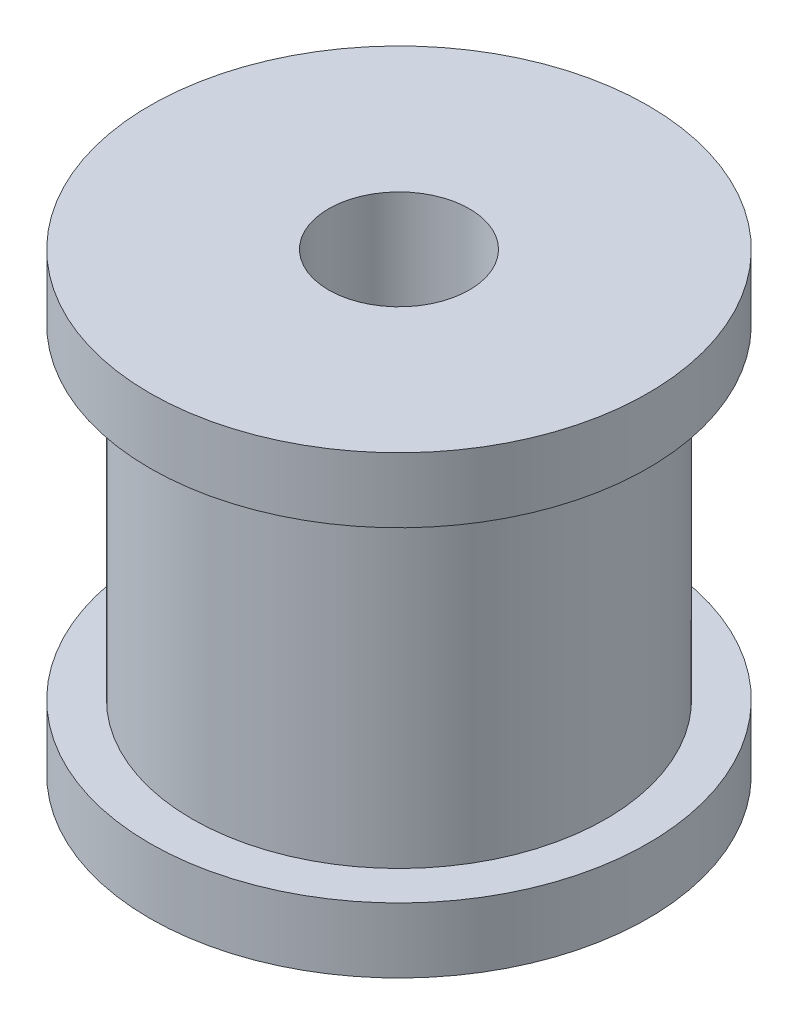
ISO-10303-21;
HEADER;
FILE_DESCRIPTION(('STEP AP214'),'2;1');
FILE_NAME('part.step','',(''),(''),'','','');
FILE_SCHEMA(('AUTOMOTIVE_DESIGN { 1 0 10303 214 1 1 1 1 }'));
ENDSEC;
DATA;
#1=APPLICATION_CONTEXT('core data for automotive mechanical design processes');
#2=APPLICATION_PROTOCOL_DEFINITION('international standard','automotive_design',2000,#1);
#3=PRODUCT_CONTEXT('',#1,'mechanical');
#4=PRODUCT('Part','Part','',(#3));
#5=PRODUCT_RELATED_PRODUCT_CATEGORY('part','',(#4));
#6=PRODUCT_DEFINITION_FORMATION('','',#4);
#7=PRODUCT_DEFINITION_CONTEXT('part definition',#1,'design');
#8=PRODUCT_DEFINITION('design','',#6,#7);
#9=PRODUCT_DEFINITION_SHAPE('','',#8);
#10=(LENGTH_UNIT() NAMED_UNIT(*) SI_UNIT(.MILLI.,.METRE.));
#11=(NAMED_UNIT(*) PLANE_ANGLE_UNIT() SI_UNIT($,.RADIAN.));
#12=(NAMED_UNIT(*) SI_UNIT($,.STERADIAN.) SOLID_ANGLE_UNIT());
#13=UNCERTAINTY_MEASURE_WITH_UNIT(LENGTH_MEASURE(1.E-05),#10,'distance_accuracy_value','');
#14=(GEOMETRIC_REPRESENTATION_CONTEXT(3) GLOBAL_UNCERTAINTY_ASSIGNED_CONTEXT((#13)) GLOBAL_UNIT_ASSIGNED_CONTEXT((#10,
#11,#12)) REPRESENTATION_CONTEXT('',''));
#15=CARTESIAN_POINT('',(0.,0.,0.));
#16=DIRECTION('',(0.,0.,1.));
#17=DIRECTION('',(1.,0.,0.));
#18=AXIS2_PLACEMENT_3D('',#15,#16,#17);
#19=CARTESIAN_POINT('',(0.,3.,0.));
#20=DIRECTION('',(0.,1.,0.));
#21=DIRECTION('',(0.,0.,1.));
#22=AXIS2_PLACEMENT_3D('',#19,#20,#21);
#23=PLANE('',#22);
#24=CARTESIAN_POINT('',(0.,3.,0.));
#25=DIRECTION('',(0.,1.,0.));
#26=DIRECTION('',(0.,0.,1.));
#27=AXIS2_PLACEMENT_3D('',#24,#25,#26);
#28=CIRCLE('',#27,9.55);
#29=CARTESIAN_POINT('',(0.,3.,9.55));
#30=VERTEX_POINT('',#29);
#31=EDGE_CURVE('E10',#30,#30,#28,.T.);
#32=ORIENTED_EDGE('',*,*,#31,.F.);
#33=EDGE_LOOP('',(#32));
#34=FACE_BOUND('',#33,.T.);
#35=CARTESIAN_POINT('',(0.,3.,0.));
#36=DIRECTION('',(0.,1.,0.));
#37=DIRECTION('',(0.,0.,1.));
#38=AXIS2_PLACEMENT_3D('',#35,#36,#37);
#39=CIRCLE('',#38,11.5);
#40=CARTESIAN_POINT('',(0.,3.,11.5));
#41=VERTEX_POINT('',#40);
#42=EDGE_CURVE('E46',#41,#41,#39,.T.);
#43=ORIENTED_EDGE('',*,*,#42,.T.);
#44=EDGE_LOOP('',(#43));
#45=FACE_BOUND('',#44,.T.);
#46=ADVANCED_FACE('F37',(#34,#45),#23,.T.);
#47=CARTESIAN_POINT('',(0.,0.,0.));
#48=DIRECTION('',(0.,1.,0.));
#49=DIRECTION('',(0.,0.,1.));
#50=AXIS2_PLACEMENT_3D('',#47,#48,#49);
#51=PLANE('',#50);
#52=CARTESIAN_POINT('',(0.,0.,0.));
#53=DIRECTION('',(0.,1.,0.));
#54=DIRECTION('',(0.,0.,1.));
#55=AXIS2_PLACEMENT_3D('',#52,#53,#54);
#56=CIRCLE('',#55,11.5);
#57=CARTESIAN_POINT('',(0.,0.,11.5));
#58=VERTEX_POINT('',#57);
#59=EDGE_CURVE('E41',#58,#58,#56,.T.);
#60=ORIENTED_EDGE('',*,*,#59,.F.);
#61=EDGE_LOOP('',(#60));
#62=FACE_BOUND('',#61,.T.);
#63=CARTESIAN_POINT('',(0.,0.,0.));
#64=DIRECTION('',(0.,1.,0.));
#65=DIRECTION('',(0.,0.,1.));
#66=AXIS2_PLACEMENT_3D('',#63,#64,#65);
#67=CIRCLE('',#66,3.25);
#68=CARTESIAN_POINT('',(0.,0.,3.25));
#69=VERTEX_POINT('',#68);
#70=EDGE_CURVE('E56',#69,#69,#67,.T.);
#71=ORIENTED_EDGE('',*,*,#70,.T.);
#72=EDGE_LOOP('',(#71));
#73=FACE_BOUND('',#72,.T.);
#74=ADVANCED_FACE('F98',(#62,#73),#51,.F.);
#75=CARTESIAN_POINT('',(0.,3.,0.));
#76=DIRECTION('',(0.,-1.,0.));
#77=DIRECTION('',(0.,0.,-1.));
#78=AXIS2_PLACEMENT_3D('',#75,#76,#77);
#79=CYLINDRICAL_SURFACE('',#78,11.5);
#80=ORIENTED_EDGE('',*,*,#42,.F.);
#81=EDGE_LOOP('',(#80));
#82=FACE_BOUND('',#81,.T.);
#83=ORIENTED_EDGE('',*,*,#59,.T.);
#84=EDGE_LOOP('',(#83));
#85=FACE_BOUND('',#84,.T.);
#86=ADVANCED_FACE('F39',(#82,#85),#79,.T.);
#87=CARTESIAN_POINT('',(0.,3.,0.));
#88=DIRECTION('',(0.,-1.,0.));
#89=DIRECTION('',(0.,0.,-1.));
#90=AXIS2_PLACEMENT_3D('',#87,#88,#89);
#91=CYLINDRICAL_SURFACE('',#90,3.25);
#92=ORIENTED_EDGE('',*,*,#70,.F.);
#93=EDGE_LOOP('',(#92));
#94=FACE_BOUND('',#93,.T.);
#95=CARTESIAN_POINT('',(0.,21.,0.));
#96=DIRECTION('',(0.,1.,0.));
#97=DIRECTION('',(0.,0.,1.));
#98=AXIS2_PLACEMENT_3D('',#95,#96,#97);
#99=CIRCLE('',#98,3.25);
#100=CARTESIAN_POINT('',(0.,21.,3.25));
#101=VERTEX_POINT('',#100);
#102=EDGE_CURVE('E76',#101,#101,#99,.T.);
#103=ORIENTED_EDGE('',*,*,#102,.T.);
#104=EDGE_LOOP('',(#103));
#105=FACE_BOUND('',#104,.T.);
#106=ADVANCED_FACE('F82',(#94,#105),#91,.F.);
#107=CARTESIAN_POINT('',(0.,18.,0.));
#108=DIRECTION('',(0.,-1.,0.));
#109=DIRECTION('',(0.,0.,-1.));
#110=AXIS2_PLACEMENT_3D('',#107,#108,#109);
#111=CYLINDRICAL_SURFACE('',#110,9.55);
#112=CARTESIAN_POINT('',(0.,18.,0.));
#113=DIRECTION('',(0.,1.,0.));
#114=DIRECTION('',(0.,0.,1.));
#115=AXIS2_PLACEMENT_3D('',#112,#113,#114);
#116=CIRCLE('',#115,9.55);
#117=CARTESIAN_POINT('',(0.,18.,9.55));
#118=VERTEX_POINT('',#117);
#119=EDGE_CURVE('E54',#118,#118,#116,.T.);
#120=ORIENTED_EDGE('',*,*,#119,.F.);
#121=EDGE_LOOP('',(#120));
#122=FACE_BOUND('',#121,.T.);
#123=ORIENTED_EDGE('',*,*,#31,.T.);
#124=EDGE_LOOP('',(#123));
#125=FACE_BOUND('',#124,.T.);
#126=ADVANCED_FACE('F87',(#122,#125),#111,.T.);
#127=CARTESIAN_POINT('',(0.,21.,0.));
#128=DIRECTION('',(0.,1.,0.));
#129=DIRECTION('',(0.,0.,1.));
#130=AXIS2_PLACEMENT_3D('',#127,#128,#129);
#131=PLANE('',#130);
#132=CARTESIAN_POINT('',(0.,21.,0.));
#133=DIRECTION('',(0.,1.,0.));
#134=DIRECTION('',(0.,0.,1.));
#135=AXIS2_PLACEMENT_3D('',#132,#133,#134);
#136=CIRCLE('',#135,11.5);
#137=CARTESIAN_POINT('',(0.,21.,11.5));
#138=VERTEX_POINT('',#137);
#139=EDGE_CURVE('E65',#138,#138,#136,.T.);
#140=ORIENTED_EDGE('',*,*,#139,.T.);
#141=EDGE_LOOP('',(#140));
#142=FACE_BOUND('',#141,.T.);
#143=ORIENTED_EDGE('',*,*,#102,.F.);
#144=EDGE_LOOP('',(#143));
#145=FACE_BOUND('',#144,.T.);
#146=ADVANCED_FACE('F84',(#142,#145),#131,.T.);
#147=CARTESIAN_POINT('',(0.,18.,0.));
#148=DIRECTION('',(0.,1.,0.));
#149=DIRECTION('',(0.,0.,1.));
#150=AXIS2_PLACEMENT_3D('',#147,#148,#149);
#151=PLANE('',#150);
#152=ORIENTED_EDGE('',*,*,#119,.T.);
#153=EDGE_LOOP('',(#152));
#154=FACE_BOUND('',#153,.T.);
#155=CARTESIAN_POINT('',(0.,18.,0.));
#156=DIRECTION('',(0.,1.,0.));
#157=DIRECTION('',(0.,0.,1.));
#158=AXIS2_PLACEMENT_3D('',#155,#156,#157);
#159=CIRCLE('',#158,11.5);
#160=CARTESIAN_POINT('',(0.,18.,11.5));
#161=VERTEX_POINT('',#160);
#162=EDGE_CURVE('E70',#161,#161,#159,.T.);
#163=ORIENTED_EDGE('',*,*,#162,.F.);
#164=EDGE_LOOP('',(#163));
#165=FACE_BOUND('',#164,.T.);
#166=ADVANCED_FACE('F86',(#154,#165),#151,.F.);
#167=CARTESIAN_POINT('',(0.,21.,0.));
#168=DIRECTION('',(0.,-1.,0.));
#169=DIRECTION('',(0.,0.,-1.));
#170=AXIS2_PLACEMENT_3D('',#167,#168,#169);
#171=CYLINDRICAL_SURFACE('',#170,11.5);
#172=ORIENTED_EDGE('',*,*,#139,.F.);
#173=EDGE_LOOP('',(#172));
#174=FACE_BOUND('',#173,.T.);
#175=ORIENTED_EDGE('',*,*,#162,.T.);
#176=EDGE_LOOP('',(#175));
#177=FACE_BOUND('',#176,.T.);
#178=ADVANCED_FACE('F93',(#174,#177),#171,.T.);
#179=CLOSED_SHELL('',(#46,#74,#86,#106,#126,#146,#166,#178));
#180=MANIFOLD_SOLID_BREP('B2',#179);
#181=ADVANCED_BREP_SHAPE_REPRESENTATION('',(#18,#180),#14);
#182=SHAPE_DEFINITION_REPRESENTATION(#9,#181);
ENDSEC;
END-ISO-10303-21;
